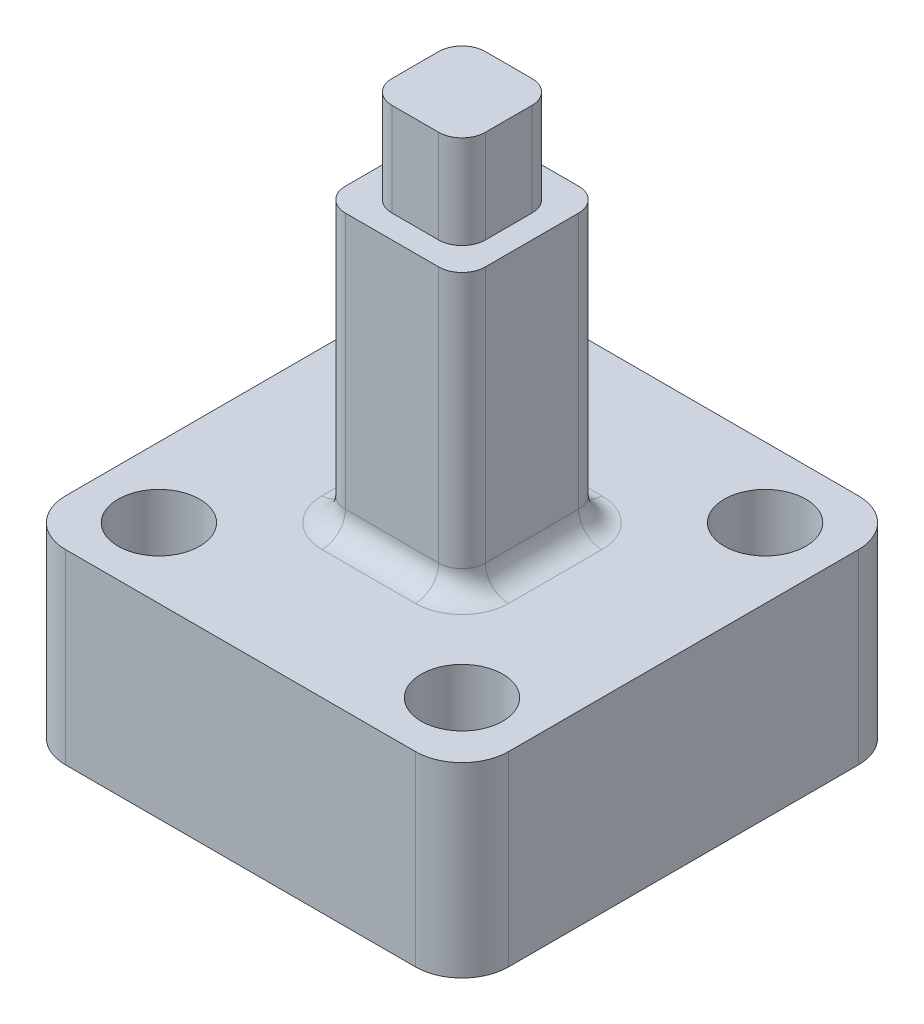
ISO-10303-21;
HEADER;
FILE_DESCRIPTION(('STEP AP214'),'2;1');
FILE_NAME('part.step','',(''),(''),'','','');
FILE_SCHEMA(('AUTOMOTIVE_DESIGN { 1 0 10303 214 1 1 1 1 }'));
ENDSEC;
DATA;
#1=APPLICATION_CONTEXT('core data for automotive mechanical design processes');
#2=APPLICATION_PROTOCOL_DEFINITION('international standard','automotive_design',2000,#1);
#3=PRODUCT_CONTEXT('',#1,'mechanical');
#4=PRODUCT('Part','Part','',(#3));
#5=PRODUCT_RELATED_PRODUCT_CATEGORY('part','',(#4));
#6=PRODUCT_DEFINITION_FORMATION('','',#4);
#7=PRODUCT_DEFINITION_CONTEXT('part definition',#1,'design');
#8=PRODUCT_DEFINITION('design','',#6,#7);
#9=PRODUCT_DEFINITION_SHAPE('','',#8);
#10=(LENGTH_UNIT() NAMED_UNIT(*) SI_UNIT(.MILLI.,.METRE.));
#11=(NAMED_UNIT(*) PLANE_ANGLE_UNIT() SI_UNIT($,.RADIAN.));
#12=(NAMED_UNIT(*) SI_UNIT($,.STERADIAN.) SOLID_ANGLE_UNIT());
#13=UNCERTAINTY_MEASURE_WITH_UNIT(LENGTH_MEASURE(1.E-05),#10,'distance_accuracy_value','');
#14=(GEOMETRIC_REPRESENTATION_CONTEXT(3) GLOBAL_UNCERTAINTY_ASSIGNED_CONTEXT((#13)) GLOBAL_UNIT_ASSIGNED_CONTEXT((#10,
#11,#12)) REPRESENTATION_CONTEXT('',''));
#15=CARTESIAN_POINT('',(0.,0.,0.));
#16=DIRECTION('',(0.,0.,1.));
#17=DIRECTION('',(1.,0.,0.));
#18=AXIS2_PLACEMENT_3D('',#15,#16,#17);
#19=CARTESIAN_POINT('',(0.,8.,0.));
#20=DIRECTION('',(0.,1.,0.));
#21=DIRECTION('',(0.,0.,1.));
#22=AXIS2_PLACEMENT_3D('',#19,#20,#21);
#23=PLANE('',#22);
#24=DIRECTION('',(1.,0.,0.));
#25=VECTOR('',#24,1.);
#26=CARTESIAN_POINT('',(9.5,8.,9.5));
#27=LINE('',#26,#25);
#28=CARTESIAN_POINT('',(-7.5,8.,9.5));
#29=VERTEX_POINT('',#28);
#30=CARTESIAN_POINT('',(7.5,8.,9.5));
#31=VERTEX_POINT('',#30);
#32=EDGE_CURVE('E560',#29,#31,#27,.T.);
#33=ORIENTED_EDGE('',*,*,#32,.T.);
#34=CARTESIAN_POINT('',(7.5,8.,7.5));
#35=DIRECTION('',(0.,1.,0.));
#36=DIRECTION('',(0.,0.,1.));
#37=AXIS2_PLACEMENT_3D('',#34,#35,#36);
#38=CIRCLE('',#37,2.);
#39=CARTESIAN_POINT('',(9.5,8.,7.5));
#40=VERTEX_POINT('',#39);
#41=EDGE_CURVE('E299',#31,#40,#38,.T.);
#42=ORIENTED_EDGE('',*,*,#41,.T.);
#43=DIRECTION('',(0.,0.,-1.));
#44=VECTOR('',#43,1.);
#45=CARTESIAN_POINT('',(9.5,8.,9.5));
#46=LINE('',#45,#44);
#47=CARTESIAN_POINT('',(9.5,8.,-7.5));
#48=VERTEX_POINT('',#47);
#49=EDGE_CURVE('E255',#40,#48,#46,.T.);
#50=ORIENTED_EDGE('',*,*,#49,.T.);
#51=CARTESIAN_POINT('',(7.5,8.,-7.5));
#52=DIRECTION('',(0.,1.,0.));
#53=DIRECTION('',(0.,0.,1.));
#54=AXIS2_PLACEMENT_3D('',#51,#52,#53);
#55=CIRCLE('',#54,2.);
#56=CARTESIAN_POINT('',(7.5,8.,-9.5));
#57=VERTEX_POINT('',#56);
#58=EDGE_CURVE('E296',#48,#57,#55,.T.);
#59=ORIENTED_EDGE('',*,*,#58,.T.);
#60=DIRECTION('',(-1.,0.,0.));
#61=VECTOR('',#60,1.);
#62=CARTESIAN_POINT('',(9.5,8.,-9.5));
#63=LINE('',#62,#61);
#64=CARTESIAN_POINT('',(-7.5,8.,-9.5));
#65=VERTEX_POINT('',#64);
#66=EDGE_CURVE('E276',#57,#65,#63,.T.);
#67=ORIENTED_EDGE('',*,*,#66,.T.);
#68=CARTESIAN_POINT('',(-7.5,8.,-7.5));
#69=DIRECTION('',(0.,1.,0.));
#70=DIRECTION('',(0.,0.,1.));
#71=AXIS2_PLACEMENT_3D('',#68,#69,#70);
#72=CIRCLE('',#71,2.);
#73=CARTESIAN_POINT('',(-9.5,8.,-7.5));
#74=VERTEX_POINT('',#73);
#75=EDGE_CURVE('E290',#65,#74,#72,.T.);
#76=ORIENTED_EDGE('',*,*,#75,.T.);
#77=DIRECTION('',(0.,0.,1.));
#78=VECTOR('',#77,1.);
#79=CARTESIAN_POINT('',(-9.5,8.,9.5));
#80=LINE('',#79,#78);
#81=CARTESIAN_POINT('',(-9.5,8.,7.5));
#82=VERTEX_POINT('',#81);
#83=EDGE_CURVE('E269',#74,#82,#80,.T.);
#84=ORIENTED_EDGE('',*,*,#83,.T.);
#85=CARTESIAN_POINT('',(-7.5,8.,7.5));
#86=DIRECTION('',(0.,1.,0.));
#87=DIRECTION('',(0.,0.,1.));
#88=AXIS2_PLACEMENT_3D('',#85,#86,#87);
#89=CIRCLE('',#88,2.);
#90=EDGE_CURVE('E293',#82,#29,#89,.T.);
#91=ORIENTED_EDGE('',*,*,#90,.T.);
#92=EDGE_LOOP('',(#33,#42,#50,#59,#67,#76,#84,#91));
#93=FACE_BOUND('',#92,.T.);
#94=CARTESIAN_POINT('',(-6.5,8.,-6.5));
#95=DIRECTION('',(0.,1.,0.));
#96=DIRECTION('',(0.,0.,1.));
#97=AXIS2_PLACEMENT_3D('',#94,#95,#96);
#98=CIRCLE('',#97,1.75);
#99=CARTESIAN_POINT('',(-6.5,8.,-4.75));
#100=VERTEX_POINT('',#99);
#101=EDGE_CURVE('E538',#100,#100,#98,.T.);
#102=ORIENTED_EDGE('',*,*,#101,.F.);
#103=EDGE_LOOP('',(#102));
#104=FACE_BOUND('',#103,.T.);
#105=CARTESIAN_POINT('',(6.5,8.,6.5));
#106=DIRECTION('',(0.,1.,0.));
#107=DIRECTION('',(0.,0.,1.));
#108=AXIS2_PLACEMENT_3D('',#105,#106,#107);
#109=CIRCLE('',#108,1.75);
#110=CARTESIAN_POINT('',(6.5,8.,8.25));
#111=VERTEX_POINT('',#110);
#112=EDGE_CURVE('E526',#111,#111,#109,.T.);
#113=ORIENTED_EDGE('',*,*,#112,.F.);
#114=EDGE_LOOP('',(#113));
#115=FACE_BOUND('',#114,.T.);
#116=CARTESIAN_POINT('',(-6.5,8.,6.5));
#117=DIRECTION('',(0.,1.,0.));
#118=DIRECTION('',(0.,0.,1.));
#119=AXIS2_PLACEMENT_3D('',#116,#117,#118);
#120=CIRCLE('',#119,1.75);
#121=CARTESIAN_POINT('',(-6.5,8.,8.25));
#122=VERTEX_POINT('',#121);
#123=EDGE_CURVE('E543',#122,#122,#120,.T.);
#124=ORIENTED_EDGE('',*,*,#123,.F.);
#125=EDGE_LOOP('',(#124));
#126=FACE_BOUND('',#125,.T.);
#127=CARTESIAN_POINT('',(6.5,8.,-6.5));
#128=DIRECTION('',(0.,1.,0.));
#129=DIRECTION('',(0.,0.,1.));
#130=AXIS2_PLACEMENT_3D('',#127,#128,#129);
#131=CIRCLE('',#130,1.75);
#132=CARTESIAN_POINT('',(6.5,8.,-4.75));
#133=VERTEX_POINT('',#132);
#134=EDGE_CURVE('E534',#133,#133,#131,.T.);
#135=ORIENTED_EDGE('',*,*,#134,.F.);
#136=EDGE_LOOP('',(#135));
#137=FACE_BOUND('',#136,.T.);
#138=CARTESIAN_POINT('',(-2.,8.,-2.));
#139=DIRECTION('',(0.,1.,0.));
#140=DIRECTION('',(0.,0.,1.));
#141=AXIS2_PLACEMENT_3D('',#138,#139,#140);
#142=CIRCLE('',#141,2.);
#143=CARTESIAN_POINT('',(-2.,8.,-4.));
#144=VERTEX_POINT('',#143);
#145=CARTESIAN_POINT('',(-4.,8.,-2.));
#146=VERTEX_POINT('',#145);
#147=EDGE_CURVE('E351',#144,#146,#142,.T.);
#148=ORIENTED_EDGE('',*,*,#147,.F.);
#149=DIRECTION('',(-1.,0.,0.));
#150=VECTOR('',#149,1.);
#151=CARTESIAN_POINT('',(0.,8.,-4.));
#152=LINE('',#151,#150);
#153=CARTESIAN_POINT('',(2.,8.,-4.));
#154=VERTEX_POINT('',#153);
#155=EDGE_CURVE('E347',#144,#154,#152,.F.);
#156=ORIENTED_EDGE('',*,*,#155,.T.);
#157=CARTESIAN_POINT('',(2.,8.,-2.));
#158=DIRECTION('',(0.,1.,0.));
#159=DIRECTION('',(0.,0.,1.));
#160=AXIS2_PLACEMENT_3D('',#157,#158,#159);
#161=CIRCLE('',#160,2.);
#162=CARTESIAN_POINT('',(4.,8.,-2.));
#163=VERTEX_POINT('',#162);
#164=EDGE_CURVE('E343',#163,#154,#161,.T.);
#165=ORIENTED_EDGE('',*,*,#164,.F.);
#166=DIRECTION('',(0.,0.,-1.));
#167=VECTOR('',#166,1.);
#168=CARTESIAN_POINT('',(4.,8.,0.));
#169=LINE('',#168,#167);
#170=CARTESIAN_POINT('',(4.,8.,2.));
#171=VERTEX_POINT('',#170);
#172=EDGE_CURVE('E337',#163,#171,#169,.F.);
#173=ORIENTED_EDGE('',*,*,#172,.T.);
#174=CARTESIAN_POINT('',(2.,8.,2.));
#175=DIRECTION('',(0.,1.,0.));
#176=DIRECTION('',(0.,0.,1.));
#177=AXIS2_PLACEMENT_3D('',#174,#175,#176);
#178=CIRCLE('',#177,2.);
#179=CARTESIAN_POINT('',(2.,8.,4.));
#180=VERTEX_POINT('',#179);
#181=EDGE_CURVE('E333',#180,#171,#178,.T.);
#182=ORIENTED_EDGE('',*,*,#181,.F.);
#183=DIRECTION('',(1.,0.,0.));
#184=VECTOR('',#183,1.);
#185=CARTESIAN_POINT('',(0.,8.,4.));
#186=LINE('',#185,#184);
#187=CARTESIAN_POINT('',(-2.,8.,4.));
#188=VERTEX_POINT('',#187);
#189=EDGE_CURVE('E330',#180,#188,#186,.F.);
#190=ORIENTED_EDGE('',*,*,#189,.T.);
#191=CARTESIAN_POINT('',(-2.,8.,2.));
#192=DIRECTION('',(0.,1.,0.));
#193=DIRECTION('',(0.,0.,1.));
#194=AXIS2_PLACEMENT_3D('',#191,#192,#193);
#195=CIRCLE('',#194,2.);
#196=CARTESIAN_POINT('',(-4.,8.,2.));
#197=VERTEX_POINT('',#196);
#198=EDGE_CURVE('E326',#197,#188,#195,.T.);
#199=ORIENTED_EDGE('',*,*,#198,.F.);
#200=DIRECTION('',(0.,0.,1.));
#201=VECTOR('',#200,1.);
#202=CARTESIAN_POINT('',(-4.,8.,0.));
#203=LINE('',#202,#201);
#204=EDGE_CURVE('E340',#197,#146,#203,.F.);
#205=ORIENTED_EDGE('',*,*,#204,.T.);
#206=EDGE_LOOP('',(#148,#156,#165,#173,#182,#190,#199,#205));
#207=FACE_BOUND('',#206,.T.);
#208=ADVANCED_FACE('F47',(#93,#104,#115,#126,#137,#207),#23,.T.);
#209=CARTESIAN_POINT('',(-9.5,8.,9.5));
#210=DIRECTION('',(1.,0.,0.));
#211=DIRECTION('',(0.,0.,-1.));
#212=AXIS2_PLACEMENT_3D('',#209,#210,#211);
#213=PLANE('',#212);
#214=DIRECTION('',(0.,0.,1.));
#215=VECTOR('',#214,1.);
#216=CARTESIAN_POINT('',(-9.5,0.,9.5));
#217=LINE('',#216,#215);
#218=CARTESIAN_POINT('',(-9.5,0.,-7.5));
#219=VERTEX_POINT('',#218);
#220=CARTESIAN_POINT('',(-9.5,0.,7.5));
#221=VERTEX_POINT('',#220);
#222=EDGE_CURVE('E271',#219,#221,#217,.T.);
#223=ORIENTED_EDGE('',*,*,#222,.T.);
#224=DIRECTION('',(0.,-1.,0.));
#225=VECTOR('',#224,1.);
#226=CARTESIAN_POINT('',(-9.5,8.,7.5));
#227=LINE('',#226,#225);
#228=EDGE_CURVE('E313',#221,#82,#227,.F.);
#229=ORIENTED_EDGE('',*,*,#228,.T.);
#230=ORIENTED_EDGE('',*,*,#83,.F.);
#231=DIRECTION('',(0.,-1.,0.));
#232=VECTOR('',#231,1.);
#233=CARTESIAN_POINT('',(-9.5,8.,-7.5));
#234=LINE('',#233,#232);
#235=EDGE_CURVE('E309',#74,#219,#234,.T.);
#236=ORIENTED_EDGE('',*,*,#235,.T.);
#237=EDGE_LOOP('',(#223,#229,#230,#236));
#238=FACE_BOUND('',#237,.T.);
#239=ADVANCED_FACE('F573',(#238),#213,.F.);
#240=CARTESIAN_POINT('',(9.5,8.,9.5));
#241=DIRECTION('',(0.,0.,-1.));
#242=DIRECTION('',(-1.,0.,0.));
#243=AXIS2_PLACEMENT_3D('',#240,#241,#242);
#244=PLANE('',#243);
#245=DIRECTION('',(1.,0.,0.));
#246=VECTOR('',#245,1.);
#247=CARTESIAN_POINT('',(9.5,0.,9.5));
#248=LINE('',#247,#246);
#249=CARTESIAN_POINT('',(-7.5,0.,9.5));
#250=VERTEX_POINT('',#249);
#251=CARTESIAN_POINT('',(7.5,0.,9.5));
#252=VERTEX_POINT('',#251);
#253=EDGE_CURVE('E264',#250,#252,#248,.T.);
#254=ORIENTED_EDGE('',*,*,#253,.T.);
#255=DIRECTION('',(0.,-1.,0.));
#256=VECTOR('',#255,1.);
#257=CARTESIAN_POINT('',(7.5,8.,9.5));
#258=LINE('',#257,#256);
#259=EDGE_CURVE('E239',#252,#31,#258,.F.);
#260=ORIENTED_EDGE('',*,*,#259,.T.);
#261=ORIENTED_EDGE('',*,*,#32,.F.);
#262=DIRECTION('',(0.,-1.,0.));
#263=VECTOR('',#262,1.);
#264=CARTESIAN_POINT('',(-7.5,8.,9.5));
#265=LINE('',#264,#263);
#266=EDGE_CURVE('E245',#29,#250,#265,.T.);
#267=ORIENTED_EDGE('',*,*,#266,.T.);
#268=EDGE_LOOP('',(#254,#260,#261,#267));
#269=FACE_BOUND('',#268,.T.);
#270=ADVANCED_FACE('F584',(#269),#244,.F.);
#271=CARTESIAN_POINT('',(9.5,8.,9.5));
#272=DIRECTION('',(-1.,0.,0.));
#273=DIRECTION('',(0.,0.,1.));
#274=AXIS2_PLACEMENT_3D('',#271,#272,#273);
#275=PLANE('',#274);
#276=ORIENTED_EDGE('',*,*,#49,.F.);
#277=DIRECTION('',(0.,-1.,0.));
#278=VECTOR('',#277,1.);
#279=CARTESIAN_POINT('',(9.5,8.,7.5));
#280=LINE('',#279,#278);
#281=CARTESIAN_POINT('',(9.5,0.,7.5));
#282=VERTEX_POINT('',#281);
#283=EDGE_CURVE('E238',#40,#282,#280,.T.);
#284=ORIENTED_EDGE('',*,*,#283,.T.);
#285=DIRECTION('',(0.,0.,-1.));
#286=VECTOR('',#285,1.);
#287=CARTESIAN_POINT('',(9.5,0.,9.5));
#288=LINE('',#287,#286);
#289=CARTESIAN_POINT('',(9.5,0.,-7.5));
#290=VERTEX_POINT('',#289);
#291=EDGE_CURVE('E252',#282,#290,#288,.T.);
#292=ORIENTED_EDGE('',*,*,#291,.T.);
#293=DIRECTION('',(0.,-1.,0.));
#294=VECTOR('',#293,1.);
#295=CARTESIAN_POINT('',(9.5,8.,-7.5));
#296=LINE('',#295,#294);
#297=EDGE_CURVE('E258',#290,#48,#296,.F.);
#298=ORIENTED_EDGE('',*,*,#297,.T.);
#299=EDGE_LOOP('',(#276,#284,#292,#298));
#300=FACE_BOUND('',#299,.T.);
#301=ADVANCED_FACE('F251',(#300),#275,.F.);
#302=CARTESIAN_POINT('',(9.5,8.,-9.5));
#303=DIRECTION('',(0.,0.,1.));
#304=DIRECTION('',(1.,0.,0.));
#305=AXIS2_PLACEMENT_3D('',#302,#303,#304);
#306=PLANE('',#305);
#307=ORIENTED_EDGE('',*,*,#66,.F.);
#308=DIRECTION('',(0.,-1.,0.));
#309=VECTOR('',#308,1.);
#310=CARTESIAN_POINT('',(7.5,8.,-9.5));
#311=LINE('',#310,#309);
#312=CARTESIAN_POINT('',(7.5,0.,-9.5));
#313=VERTEX_POINT('',#312);
#314=EDGE_CURVE('E305',#57,#313,#311,.T.);
#315=ORIENTED_EDGE('',*,*,#314,.T.);
#316=DIRECTION('',(-1.,0.,0.));
#317=VECTOR('',#316,1.);
#318=CARTESIAN_POINT('',(9.5,0.,-9.5));
#319=LINE('',#318,#317);
#320=CARTESIAN_POINT('',(-7.5,0.,-9.5));
#321=VERTEX_POINT('',#320);
#322=EDGE_CURVE('E263',#313,#321,#319,.T.);
#323=ORIENTED_EDGE('',*,*,#322,.T.);
#324=DIRECTION('',(0.,-1.,0.));
#325=VECTOR('',#324,1.);
#326=CARTESIAN_POINT('',(-7.5,8.,-9.5));
#327=LINE('',#326,#325);
#328=EDGE_CURVE('E302',#321,#65,#327,.F.);
#329=ORIENTED_EDGE('',*,*,#328,.T.);
#330=EDGE_LOOP('',(#307,#315,#323,#329));
#331=FACE_BOUND('',#330,.T.);
#332=ADVANCED_FACE('F591',(#331),#306,.F.);
#333=CARTESIAN_POINT('',(0.,0.,0.));
#334=DIRECTION('',(0.,1.,0.));
#335=DIRECTION('',(0.,0.,1.));
#336=AXIS2_PLACEMENT_3D('',#333,#334,#335);
#337=PLANE('',#336);
#338=CARTESIAN_POINT('',(6.5,0.,-6.5));
#339=DIRECTION('',(0.,1.,0.));
#340=DIRECTION('',(0.,0.,1.));
#341=AXIS2_PLACEMENT_3D('',#338,#339,#340);
#342=CIRCLE('',#341,1.75);
#343=CARTESIAN_POINT('',(6.5,0.,-4.75));
#344=VERTEX_POINT('',#343);
#345=EDGE_CURVE('E539',#344,#344,#342,.T.);
#346=ORIENTED_EDGE('',*,*,#345,.T.);
#347=EDGE_LOOP('',(#346));
#348=FACE_BOUND('',#347,.T.);
#349=CARTESIAN_POINT('',(-6.5,0.,6.5));
#350=DIRECTION('',(0.,1.,0.));
#351=DIRECTION('',(0.,0.,1.));
#352=AXIS2_PLACEMENT_3D('',#349,#350,#351);
#353=CIRCLE('',#352,1.75);
#354=CARTESIAN_POINT('',(-6.5,0.,8.25));
#355=VERTEX_POINT('',#354);
#356=EDGE_CURVE('E530',#355,#355,#353,.T.);
#357=ORIENTED_EDGE('',*,*,#356,.T.);
#358=EDGE_LOOP('',(#357));
#359=FACE_BOUND('',#358,.T.);
#360=CARTESIAN_POINT('',(6.5,0.,6.5));
#361=DIRECTION('',(0.,1.,0.));
#362=DIRECTION('',(0.,0.,1.));
#363=AXIS2_PLACEMENT_3D('',#360,#361,#362);
#364=CIRCLE('',#363,1.75);
#365=CARTESIAN_POINT('',(6.5,0.,8.25));
#366=VERTEX_POINT('',#365);
#367=EDGE_CURVE('E525',#366,#366,#364,.T.);
#368=ORIENTED_EDGE('',*,*,#367,.T.);
#369=EDGE_LOOP('',(#368));
#370=FACE_BOUND('',#369,.T.);
#371=CARTESIAN_POINT('',(-6.5,0.,-6.5));
#372=DIRECTION('',(0.,1.,0.));
#373=DIRECTION('',(0.,0.,1.));
#374=AXIS2_PLACEMENT_3D('',#371,#372,#373);
#375=CIRCLE('',#374,1.75);
#376=CARTESIAN_POINT('',(-6.5,0.,-4.75));
#377=VERTEX_POINT('',#376);
#378=EDGE_CURVE('E550',#377,#377,#375,.T.);
#379=ORIENTED_EDGE('',*,*,#378,.T.);
#380=EDGE_LOOP('',(#379));
#381=FACE_BOUND('',#380,.T.);
#382=ORIENTED_EDGE('',*,*,#291,.F.);
#383=CARTESIAN_POINT('',(7.5,0.,7.5));
#384=DIRECTION('',(0.,1.,0.));
#385=DIRECTION('',(0.,0.,1.));
#386=AXIS2_PLACEMENT_3D('',#383,#384,#385);
#387=CIRCLE('',#386,2.);
#388=EDGE_CURVE('E234',#282,#252,#387,.F.);
#389=ORIENTED_EDGE('',*,*,#388,.T.);
#390=ORIENTED_EDGE('',*,*,#253,.F.);
#391=CARTESIAN_POINT('',(-7.5,0.,7.5));
#392=DIRECTION('',(0.,1.,0.));
#393=DIRECTION('',(0.,0.,1.));
#394=AXIS2_PLACEMENT_3D('',#391,#392,#393);
#395=CIRCLE('',#394,2.);
#396=EDGE_CURVE('E280',#250,#221,#395,.F.);
#397=ORIENTED_EDGE('',*,*,#396,.T.);
#398=ORIENTED_EDGE('',*,*,#222,.F.);
#399=CARTESIAN_POINT('',(-7.5,0.,-7.5));
#400=DIRECTION('',(0.,1.,0.));
#401=DIRECTION('',(0.,0.,1.));
#402=AXIS2_PLACEMENT_3D('',#399,#400,#401);
#403=CIRCLE('',#402,2.);
#404=EDGE_CURVE('E257',#219,#321,#403,.F.);
#405=ORIENTED_EDGE('',*,*,#404,.T.);
#406=ORIENTED_EDGE('',*,*,#322,.F.);
#407=CARTESIAN_POINT('',(7.5,0.,-7.5));
#408=DIRECTION('',(0.,1.,0.));
#409=DIRECTION('',(0.,0.,1.));
#410=AXIS2_PLACEMENT_3D('',#407,#408,#409);
#411=CIRCLE('',#410,2.);
#412=EDGE_CURVE('E246',#313,#290,#411,.F.);
#413=ORIENTED_EDGE('',*,*,#412,.T.);
#414=EDGE_LOOP('',(#382,#389,#390,#397,#398,#405,#406,#413));
#415=FACE_BOUND('',#414,.T.);
#416=ADVANCED_FACE('F260',(#348,#359,#370,#381,#415),#337,.F.);
#417=CARTESIAN_POINT('',(-6.5,0.,-6.5));
#418=DIRECTION('',(0.,1.,0.));
#419=DIRECTION('',(0.,0.,1.));
#420=AXIS2_PLACEMENT_3D('',#417,#418,#419);
#421=CYLINDRICAL_SURFACE('',#420,1.75);
#422=ORIENTED_EDGE('',*,*,#378,.F.);
#423=EDGE_LOOP('',(#422));
#424=FACE_BOUND('',#423,.T.);
#425=ORIENTED_EDGE('',*,*,#101,.T.);
#426=EDGE_LOOP('',(#425));
#427=FACE_BOUND('',#426,.T.);
#428=ADVANCED_FACE('F602',(#424,#427),#421,.F.);
#429=CARTESIAN_POINT('',(6.5,0.,6.5));
#430=DIRECTION('',(0.,1.,0.));
#431=DIRECTION('',(0.,0.,1.));
#432=AXIS2_PLACEMENT_3D('',#429,#430,#431);
#433=CYLINDRICAL_SURFACE('',#432,1.75);
#434=ORIENTED_EDGE('',*,*,#367,.F.);
#435=EDGE_LOOP('',(#434));
#436=FACE_BOUND('',#435,.T.);
#437=ORIENTED_EDGE('',*,*,#112,.T.);
#438=EDGE_LOOP('',(#437));
#439=FACE_BOUND('',#438,.T.);
#440=ADVANCED_FACE('F759',(#436,#439),#433,.F.);
#441=CARTESIAN_POINT('',(-6.5,0.,6.5));
#442=DIRECTION('',(0.,1.,0.));
#443=DIRECTION('',(0.,0.,1.));
#444=AXIS2_PLACEMENT_3D('',#441,#442,#443);
#445=CYLINDRICAL_SURFACE('',#444,1.75);
#446=ORIENTED_EDGE('',*,*,#356,.F.);
#447=EDGE_LOOP('',(#446));
#448=FACE_BOUND('',#447,.T.);
#449=ORIENTED_EDGE('',*,*,#123,.T.);
#450=EDGE_LOOP('',(#449));
#451=FACE_BOUND('',#450,.T.);
#452=ADVANCED_FACE('F762',(#448,#451),#445,.F.);
#453=CARTESIAN_POINT('',(6.5,0.,-6.5));
#454=DIRECTION('',(0.,1.,0.));
#455=DIRECTION('',(0.,0.,1.));
#456=AXIS2_PLACEMENT_3D('',#453,#454,#455);
#457=CYLINDRICAL_SURFACE('',#456,1.75);
#458=ORIENTED_EDGE('',*,*,#345,.F.);
#459=EDGE_LOOP('',(#458));
#460=FACE_BOUND('',#459,.T.);
#461=ORIENTED_EDGE('',*,*,#134,.T.);
#462=EDGE_LOOP('',(#461));
#463=FACE_BOUND('',#462,.T.);
#464=ADVANCED_FACE('F757',(#460,#463),#457,.F.);
#465=CARTESIAN_POINT('',(-3.,20.,3.));
#466=DIRECTION('',(1.,0.,0.));
#467=DIRECTION('',(0.,0.,-1.));
#468=AXIS2_PLACEMENT_3D('',#465,#466,#467);
#469=PLANE('',#468);
#470=DIRECTION('',(0.,0.,1.));
#471=VECTOR('',#470,1.);
#472=CARTESIAN_POINT('',(-3.,9.,3.));
#473=LINE('',#472,#471);
#474=CARTESIAN_POINT('',(-3.,9.,-2.));
#475=VERTEX_POINT('',#474);
#476=CARTESIAN_POINT('',(-3.,9.,2.));
#477=VERTEX_POINT('',#476);
#478=EDGE_CURVE('E358',#475,#477,#473,.T.);
#479=ORIENTED_EDGE('',*,*,#478,.T.);
#480=DIRECTION('',(0.,-1.,0.));
#481=VECTOR('',#480,1.);
#482=CARTESIAN_POINT('',(-3.,20.,2.));
#483=LINE('',#482,#481);
#484=CARTESIAN_POINT('',(-3.,20.,2.));
#485=VERTEX_POINT('',#484);
#486=EDGE_CURVE('E361',#477,#485,#483,.F.);
#487=ORIENTED_EDGE('',*,*,#486,.T.);
#488=DIRECTION('',(0.,0.,1.));
#489=VECTOR('',#488,1.);
#490=CARTESIAN_POINT('',(-3.,20.,3.));
#491=LINE('',#490,#489);
#492=CARTESIAN_POINT('',(-3.,20.,-2.));
#493=VERTEX_POINT('',#492);
#494=EDGE_CURVE('E509',#493,#485,#491,.T.);
#495=ORIENTED_EDGE('',*,*,#494,.F.);
#496=DIRECTION('',(0.,-1.,0.));
#497=VECTOR('',#496,1.);
#498=CARTESIAN_POINT('',(-3.,20.,-2.));
#499=LINE('',#498,#497);
#500=EDGE_CURVE('E355',#493,#475,#499,.T.);
#501=ORIENTED_EDGE('',*,*,#500,.T.);
#502=EDGE_LOOP('',(#479,#487,#495,#501));
#503=FACE_BOUND('',#502,.T.);
#504=ADVANCED_FACE('F754',(#503),#469,.F.);
#505=CARTESIAN_POINT('',(3.,20.,3.));
#506=DIRECTION('',(0.,0.,-1.));
#507=DIRECTION('',(-1.,0.,0.));
#508=AXIS2_PLACEMENT_3D('',#505,#506,#507);
#509=PLANE('',#508);
#510=DIRECTION('',(1.,0.,0.));
#511=VECTOR('',#510,1.);
#512=CARTESIAN_POINT('',(3.,9.,3.));
#513=LINE('',#512,#511);
#514=CARTESIAN_POINT('',(-2.,9.,3.));
#515=VERTEX_POINT('',#514);
#516=CARTESIAN_POINT('',(2.,9.,3.));
#517=VERTEX_POINT('',#516);
#518=EDGE_CURVE('E376',#515,#517,#513,.T.);
#519=ORIENTED_EDGE('',*,*,#518,.T.);
#520=DIRECTION('',(0.,-1.,0.));
#521=VECTOR('',#520,1.);
#522=CARTESIAN_POINT('',(2.,20.,3.));
#523=LINE('',#522,#521);
#524=CARTESIAN_POINT('',(2.,20.,3.));
#525=VERTEX_POINT('',#524);
#526=EDGE_CURVE('E379',#517,#525,#523,.F.);
#527=ORIENTED_EDGE('',*,*,#526,.T.);
#528=DIRECTION('',(1.,0.,0.));
#529=VECTOR('',#528,1.);
#530=CARTESIAN_POINT('',(3.,20.,3.));
#531=LINE('',#530,#529);
#532=CARTESIAN_POINT('',(-2.,20.,3.));
#533=VERTEX_POINT('',#532);
#534=EDGE_CURVE('E513',#533,#525,#531,.T.);
#535=ORIENTED_EDGE('',*,*,#534,.F.);
#536=DIRECTION('',(0.,-1.,0.));
#537=VECTOR('',#536,1.);
#538=CARTESIAN_POINT('',(-2.,20.,3.));
#539=LINE('',#538,#537);
#540=EDGE_CURVE('E373',#533,#515,#539,.T.);
#541=ORIENTED_EDGE('',*,*,#540,.T.);
#542=EDGE_LOOP('',(#519,#527,#535,#541));
#543=FACE_BOUND('',#542,.T.);
#544=ADVANCED_FACE('F750',(#543),#509,.F.);
#545=CARTESIAN_POINT('',(3.,20.,3.));
#546=DIRECTION('',(-1.,0.,0.));
#547=DIRECTION('',(0.,0.,1.));
#548=AXIS2_PLACEMENT_3D('',#545,#546,#547);
#549=PLANE('',#548);
#550=DIRECTION('',(0.,0.,-1.));
#551=VECTOR('',#550,1.);
#552=CARTESIAN_POINT('',(3.,20.,3.));
#553=LINE('',#552,#551);
#554=CARTESIAN_POINT('',(3.,20.,2.));
#555=VERTEX_POINT('',#554);
#556=CARTESIAN_POINT('',(3.,20.,-2.));
#557=VERTEX_POINT('',#556);
#558=EDGE_CURVE('E517',#555,#557,#553,.T.);
#559=ORIENTED_EDGE('',*,*,#558,.F.);
#560=DIRECTION('',(0.,-1.,0.));
#561=VECTOR('',#560,1.);
#562=CARTESIAN_POINT('',(3.,20.,2.));
#563=LINE('',#562,#561);
#564=CARTESIAN_POINT('',(3.,9.,2.));
#565=VERTEX_POINT('',#564);
#566=EDGE_CURVE('E370',#555,#565,#563,.T.);
#567=ORIENTED_EDGE('',*,*,#566,.T.);
#568=DIRECTION('',(0.,0.,-1.));
#569=VECTOR('',#568,1.);
#570=CARTESIAN_POINT('',(3.,9.,3.));
#571=LINE('',#570,#569);
#572=CARTESIAN_POINT('',(3.,9.,-2.));
#573=VERTEX_POINT('',#572);
#574=EDGE_CURVE('E367',#565,#573,#571,.T.);
#575=ORIENTED_EDGE('',*,*,#574,.T.);
#576=DIRECTION('',(0.,-1.,0.));
#577=VECTOR('',#576,1.);
#578=CARTESIAN_POINT('',(3.,20.,-2.));
#579=LINE('',#578,#577);
#580=EDGE_CURVE('E364',#573,#557,#579,.F.);
#581=ORIENTED_EDGE('',*,*,#580,.T.);
#582=EDGE_LOOP('',(#559,#567,#575,#581));
#583=FACE_BOUND('',#582,.T.);
#584=ADVANCED_FACE('F746',(#583),#549,.F.);
#585=CARTESIAN_POINT('',(3.,20.,-3.));
#586=DIRECTION('',(0.,0.,1.));
#587=DIRECTION('',(1.,0.,0.));
#588=AXIS2_PLACEMENT_3D('',#585,#586,#587);
#589=PLANE('',#588);
#590=DIRECTION('',(-1.,0.,0.));
#591=VECTOR('',#590,1.);
#592=CARTESIAN_POINT('',(3.,9.,-3.));
#593=LINE('',#592,#591);
#594=CARTESIAN_POINT('',(2.,9.,-3.));
#595=VERTEX_POINT('',#594);
#596=CARTESIAN_POINT('',(-2.,9.,-3.));
#597=VERTEX_POINT('',#596);
#598=EDGE_CURVE('E319',#595,#597,#593,.T.);
#599=ORIENTED_EDGE('',*,*,#598,.T.);
#600=DIRECTION('',(0.,-1.,0.));
#601=VECTOR('',#600,1.);
#602=CARTESIAN_POINT('',(-2.,20.,-3.));
#603=LINE('',#602,#601);
#604=CARTESIAN_POINT('',(-2.,20.,-3.));
#605=VERTEX_POINT('',#604);
#606=EDGE_CURVE('E323',#597,#605,#603,.F.);
#607=ORIENTED_EDGE('',*,*,#606,.T.);
#608=DIRECTION('',(-1.,0.,0.));
#609=VECTOR('',#608,1.);
#610=CARTESIAN_POINT('',(3.,20.,-3.));
#611=LINE('',#610,#609);
#612=CARTESIAN_POINT('',(2.,20.,-3.));
#613=VERTEX_POINT('',#612);
#614=EDGE_CURVE('E521',#613,#605,#611,.T.);
#615=ORIENTED_EDGE('',*,*,#614,.F.);
#616=DIRECTION('',(0.,-1.,0.));
#617=VECTOR('',#616,1.);
#618=CARTESIAN_POINT('',(2.,20.,-3.));
#619=LINE('',#618,#617);
#620=EDGE_CURVE('E316',#613,#595,#619,.T.);
#621=ORIENTED_EDGE('',*,*,#620,.T.);
#622=EDGE_LOOP('',(#599,#607,#615,#621));
#623=FACE_BOUND('',#622,.T.);
#624=ADVANCED_FACE('F743',(#623),#589,.F.);
#625=CARTESIAN_POINT('',(0.,20.,0.));
#626=DIRECTION('',(0.,1.,0.));
#627=DIRECTION('',(0.,0.,1.));
#628=AXIS2_PLACEMENT_3D('',#625,#626,#627);
#629=PLANE('',#628);
#630=DIRECTION('',(0.,0.,1.));
#631=VECTOR('',#630,1.);
#632=CARTESIAN_POINT('',(-2.,20.,2.));
#633=LINE('',#632,#631);
#634=CARTESIAN_POINT('',(-2.,20.,-1.));
#635=VERTEX_POINT('',#634);
#636=CARTESIAN_POINT('',(-2.,20.,1.));
#637=VERTEX_POINT('',#636);
#638=EDGE_CURVE('E486',#635,#637,#633,.T.);
#639=ORIENTED_EDGE('',*,*,#638,.F.);
#640=CARTESIAN_POINT('',(-1.,20.,-1.));
#641=DIRECTION('',(0.,1.,0.));
#642=DIRECTION('',(0.,0.,1.));
#643=AXIS2_PLACEMENT_3D('',#640,#641,#642);
#644=CIRCLE('',#643,1.);
#645=CARTESIAN_POINT('',(-1.,20.,-2.));
#646=VERTEX_POINT('',#645);
#647=EDGE_CURVE('E436',#635,#646,#644,.F.);
#648=ORIENTED_EDGE('',*,*,#647,.T.);
#649=DIRECTION('',(-1.,0.,0.));
#650=VECTOR('',#649,1.);
#651=CARTESIAN_POINT('',(2.,20.,-2.));
#652=LINE('',#651,#650);
#653=CARTESIAN_POINT('',(1.,20.,-2.));
#654=VERTEX_POINT('',#653);
#655=EDGE_CURVE('E504',#654,#646,#652,.T.);
#656=ORIENTED_EDGE('',*,*,#655,.F.);
#657=CARTESIAN_POINT('',(1.,20.,-1.));
#658=DIRECTION('',(0.,1.,0.));
#659=DIRECTION('',(0.,0.,1.));
#660=AXIS2_PLACEMENT_3D('',#657,#658,#659);
#661=CIRCLE('',#660,1.);
#662=CARTESIAN_POINT('',(2.,20.,-1.));
#663=VERTEX_POINT('',#662);
#664=EDGE_CURVE('E433',#654,#663,#661,.F.);
#665=ORIENTED_EDGE('',*,*,#664,.T.);
#666=DIRECTION('',(0.,0.,-1.));
#667=VECTOR('',#666,1.);
#668=CARTESIAN_POINT('',(2.,20.,2.));
#669=LINE('',#668,#667);
#670=CARTESIAN_POINT('',(2.,20.,1.));
#671=VERTEX_POINT('',#670);
#672=EDGE_CURVE('E495',#671,#663,#669,.T.);
#673=ORIENTED_EDGE('',*,*,#672,.F.);
#674=CARTESIAN_POINT('',(1.,20.,1.));
#675=DIRECTION('',(0.,1.,0.));
#676=DIRECTION('',(0.,0.,1.));
#677=AXIS2_PLACEMENT_3D('',#674,#675,#676);
#678=CIRCLE('',#677,1.);
#679=CARTESIAN_POINT('',(1.,20.,2.));
#680=VERTEX_POINT('',#679);
#681=EDGE_CURVE('E11',#671,#680,#678,.F.);
#682=ORIENTED_EDGE('',*,*,#681,.T.);
#683=DIRECTION('',(1.,0.,0.));
#684=VECTOR('',#683,1.);
#685=CARTESIAN_POINT('',(2.,20.,2.));
#686=LINE('',#685,#684);
#687=CARTESIAN_POINT('',(-1.,20.,2.));
#688=VERTEX_POINT('',#687);
#689=EDGE_CURVE('E490',#688,#680,#686,.T.);
#690=ORIENTED_EDGE('',*,*,#689,.F.);
#691=CARTESIAN_POINT('',(-1.,20.,1.));
#692=DIRECTION('',(0.,1.,0.));
#693=DIRECTION('',(0.,0.,1.));
#694=AXIS2_PLACEMENT_3D('',#691,#692,#693);
#695=CIRCLE('',#694,1.);
#696=EDGE_CURVE('E57',#688,#637,#695,.F.);
#697=ORIENTED_EDGE('',*,*,#696,.T.);
#698=EDGE_LOOP('',(#639,#648,#656,#665,#673,#682,#690,#697));
#699=FACE_BOUND('',#698,.T.);
#700=ORIENTED_EDGE('',*,*,#534,.T.);
#701=CARTESIAN_POINT('',(2.,20.,2.));
#702=DIRECTION('',(0.,1.,0.));
#703=DIRECTION('',(0.,0.,1.));
#704=AXIS2_PLACEMENT_3D('',#701,#702,#703);
#705=CIRCLE('',#704,1.);
#706=EDGE_CURVE('E430',#525,#555,#705,.T.);
#707=ORIENTED_EDGE('',*,*,#706,.T.);
#708=ORIENTED_EDGE('',*,*,#558,.T.);
#709=CARTESIAN_POINT('',(2.,20.,-2.));
#710=DIRECTION('',(0.,1.,0.));
#711=DIRECTION('',(0.,0.,1.));
#712=AXIS2_PLACEMENT_3D('',#709,#710,#711);
#713=CIRCLE('',#712,1.);
#714=EDGE_CURVE('E421',#557,#613,#713,.T.);
#715=ORIENTED_EDGE('',*,*,#714,.T.);
#716=ORIENTED_EDGE('',*,*,#614,.T.);
#717=CARTESIAN_POINT('',(-2.,20.,-2.));
#718=DIRECTION('',(0.,1.,0.));
#719=DIRECTION('',(0.,0.,1.));
#720=AXIS2_PLACEMENT_3D('',#717,#718,#719);
#721=CIRCLE('',#720,1.);
#722=EDGE_CURVE('E424',#605,#493,#721,.T.);
#723=ORIENTED_EDGE('',*,*,#722,.T.);
#724=ORIENTED_EDGE('',*,*,#494,.T.);
#725=CARTESIAN_POINT('',(-2.,20.,2.));
#726=DIRECTION('',(0.,1.,0.));
#727=DIRECTION('',(0.,0.,1.));
#728=AXIS2_PLACEMENT_3D('',#725,#726,#727);
#729=CIRCLE('',#728,1.);
#730=EDGE_CURVE('E427',#485,#533,#729,.T.);
#731=ORIENTED_EDGE('',*,*,#730,.T.);
#732=EDGE_LOOP('',(#700,#707,#708,#715,#716,#723,#724,#731));
#733=FACE_BOUND('',#732,.T.);
#734=ADVANCED_FACE('F626',(#699,#733),#629,.T.);
#735=CARTESIAN_POINT('',(7.5,8.,7.5));
#736=DIRECTION('',(0.,-1.,0.));
#737=DIRECTION('',(0.,0.,-1.));
#738=AXIS2_PLACEMENT_3D('',#735,#736,#737);
#739=CYLINDRICAL_SURFACE('',#738,2.);
#740=ORIENTED_EDGE('',*,*,#41,.F.);
#741=ORIENTED_EDGE('',*,*,#259,.F.);
#742=ORIENTED_EDGE('',*,*,#388,.F.);
#743=ORIENTED_EDGE('',*,*,#283,.F.);
#744=EDGE_LOOP('',(#740,#741,#742,#743));
#745=FACE_BOUND('',#744,.T.);
#746=ADVANCED_FACE('F237',(#745),#739,.T.);
#747=CARTESIAN_POINT('',(7.5,8.,-7.5));
#748=DIRECTION('',(0.,-1.,0.));
#749=DIRECTION('',(0.,0.,-1.));
#750=AXIS2_PLACEMENT_3D('',#747,#748,#749);
#751=CYLINDRICAL_SURFACE('',#750,2.);
#752=ORIENTED_EDGE('',*,*,#58,.F.);
#753=ORIENTED_EDGE('',*,*,#297,.F.);
#754=ORIENTED_EDGE('',*,*,#412,.F.);
#755=ORIENTED_EDGE('',*,*,#314,.F.);
#756=EDGE_LOOP('',(#752,#753,#754,#755));
#757=FACE_BOUND('',#756,.T.);
#758=ADVANCED_FACE('F617',(#757),#751,.T.);
#759=CARTESIAN_POINT('',(-7.5,8.,7.5));
#760=DIRECTION('',(0.,-1.,0.));
#761=DIRECTION('',(0.,0.,-1.));
#762=AXIS2_PLACEMENT_3D('',#759,#760,#761);
#763=CYLINDRICAL_SURFACE('',#762,2.);
#764=ORIENTED_EDGE('',*,*,#90,.F.);
#765=ORIENTED_EDGE('',*,*,#228,.F.);
#766=ORIENTED_EDGE('',*,*,#396,.F.);
#767=ORIENTED_EDGE('',*,*,#266,.F.);
#768=EDGE_LOOP('',(#764,#765,#766,#767));
#769=FACE_BOUND('',#768,.T.);
#770=ADVANCED_FACE('F578',(#769),#763,.T.);
#771=CARTESIAN_POINT('',(-7.5,8.,-7.5));
#772=DIRECTION('',(0.,-1.,0.));
#773=DIRECTION('',(0.,0.,-1.));
#774=AXIS2_PLACEMENT_3D('',#771,#772,#773);
#775=CYLINDRICAL_SURFACE('',#774,2.);
#776=ORIENTED_EDGE('',*,*,#75,.F.);
#777=ORIENTED_EDGE('',*,*,#328,.F.);
#778=ORIENTED_EDGE('',*,*,#404,.F.);
#779=ORIENTED_EDGE('',*,*,#235,.F.);
#780=EDGE_LOOP('',(#776,#777,#778,#779));
#781=FACE_BOUND('',#780,.T.);
#782=ADVANCED_FACE('F624',(#781),#775,.T.);
#783=CARTESIAN_POINT('',(-2.,24.,2.));
#784=DIRECTION('',(1.,0.,0.));
#785=DIRECTION('',(0.,0.,-1.));
#786=AXIS2_PLACEMENT_3D('',#783,#784,#785);
#787=PLANE('',#786);
#788=DIRECTION('',(0.,0.,1.));
#789=VECTOR('',#788,1.);
#790=CARTESIAN_POINT('',(-2.,24.,2.));
#791=LINE('',#790,#789);
#792=CARTESIAN_POINT('',(-2.,24.,-1.));
#793=VERTEX_POINT('',#792);
#794=CARTESIAN_POINT('',(-2.,24.,1.));
#795=VERTEX_POINT('',#794);
#796=EDGE_CURVE('E508',#793,#795,#791,.T.);
#797=ORIENTED_EDGE('',*,*,#796,.F.);
#798=DIRECTION('',(0.,-1.,0.));
#799=VECTOR('',#798,1.);
#800=CARTESIAN_POINT('',(-2.,24.,-1.));
#801=LINE('',#800,#799);
#802=EDGE_CURVE('E411',#793,#635,#801,.T.);
#803=ORIENTED_EDGE('',*,*,#802,.T.);
#804=ORIENTED_EDGE('',*,*,#638,.T.);
#805=DIRECTION('',(0.,-1.,0.));
#806=VECTOR('',#805,1.);
#807=CARTESIAN_POINT('',(-2.,24.,1.));
#808=LINE('',#807,#806);
#809=EDGE_CURVE('E408',#637,#795,#808,.F.);
#810=ORIENTED_EDGE('',*,*,#809,.T.);
#811=EDGE_LOOP('',(#797,#803,#804,#810));
#812=FACE_BOUND('',#811,.T.);
#813=ADVANCED_FACE('F630',(#812),#787,.F.);
#814=CARTESIAN_POINT('',(2.,24.,2.));
#815=DIRECTION('',(0.,0.,-1.));
#816=DIRECTION('',(-1.,0.,0.));
#817=AXIS2_PLACEMENT_3D('',#814,#815,#816);
#818=PLANE('',#817);
#819=DIRECTION('',(1.,0.,0.));
#820=VECTOR('',#819,1.);
#821=CARTESIAN_POINT('',(2.,24.,2.));
#822=LINE('',#821,#820);
#823=CARTESIAN_POINT('',(-1.,24.,2.));
#824=VERTEX_POINT('',#823);
#825=CARTESIAN_POINT('',(1.,24.,2.));
#826=VERTEX_POINT('',#825);
#827=EDGE_CURVE('E699',#824,#826,#822,.T.);
#828=ORIENTED_EDGE('',*,*,#827,.F.);
#829=DIRECTION('',(0.,-1.,0.));
#830=VECTOR('',#829,1.);
#831=CARTESIAN_POINT('',(-1.,24.,2.));
#832=LINE('',#831,#830);
#833=EDGE_CURVE('E418',#824,#688,#832,.T.);
#834=ORIENTED_EDGE('',*,*,#833,.T.);
#835=ORIENTED_EDGE('',*,*,#689,.T.);
#836=DIRECTION('',(0.,-1.,0.));
#837=VECTOR('',#836,1.);
#838=CARTESIAN_POINT('',(1.,24.,2.));
#839=LINE('',#838,#837);
#840=EDGE_CURVE('E415',#680,#826,#839,.F.);
#841=ORIENTED_EDGE('',*,*,#840,.T.);
#842=EDGE_LOOP('',(#828,#834,#835,#841));
#843=FACE_BOUND('',#842,.T.);
#844=ADVANCED_FACE('F703',(#843),#818,.F.);
#845=CARTESIAN_POINT('',(2.,24.,2.));
#846=DIRECTION('',(-1.,0.,0.));
#847=DIRECTION('',(0.,0.,1.));
#848=AXIS2_PLACEMENT_3D('',#845,#846,#847);
#849=PLANE('',#848);
#850=ORIENTED_EDGE('',*,*,#672,.T.);
#851=DIRECTION('',(0.,-1.,0.));
#852=VECTOR('',#851,1.);
#853=CARTESIAN_POINT('',(2.,24.,-1.));
#854=LINE('',#853,#852);
#855=CARTESIAN_POINT('',(2.,24.,-1.));
#856=VERTEX_POINT('',#855);
#857=EDGE_CURVE('E393',#663,#856,#854,.F.);
#858=ORIENTED_EDGE('',*,*,#857,.T.);
#859=DIRECTION('',(0.,0.,-1.));
#860=VECTOR('',#859,1.);
#861=CARTESIAN_POINT('',(2.,24.,2.));
#862=LINE('',#861,#860);
#863=CARTESIAN_POINT('',(2.,24.,1.));
#864=VERTEX_POINT('',#863);
#865=EDGE_CURVE('E706',#864,#856,#862,.T.);
#866=ORIENTED_EDGE('',*,*,#865,.F.);
#867=DIRECTION('',(0.,-1.,0.));
#868=VECTOR('',#867,1.);
#869=CARTESIAN_POINT('',(2.,24.,1.));
#870=LINE('',#869,#868);
#871=EDGE_CURVE('E389',#864,#671,#870,.T.);
#872=ORIENTED_EDGE('',*,*,#871,.T.);
#873=EDGE_LOOP('',(#850,#858,#866,#872));
#874=FACE_BOUND('',#873,.T.);
#875=ADVANCED_FACE('F725',(#874),#849,.F.);
#876=CARTESIAN_POINT('',(2.,24.,-2.));
#877=DIRECTION('',(0.,0.,1.));
#878=DIRECTION('',(1.,0.,0.));
#879=AXIS2_PLACEMENT_3D('',#876,#877,#878);
#880=PLANE('',#879);
#881=DIRECTION('',(-1.,0.,0.));
#882=VECTOR('',#881,1.);
#883=CARTESIAN_POINT('',(2.,24.,-2.));
#884=LINE('',#883,#882);
#885=CARTESIAN_POINT('',(1.,24.,-2.));
#886=VERTEX_POINT('',#885);
#887=CARTESIAN_POINT('',(-1.,24.,-2.));
#888=VERTEX_POINT('',#887);
#889=EDGE_CURVE('E498',#886,#888,#884,.T.);
#890=ORIENTED_EDGE('',*,*,#889,.F.);
#891=DIRECTION('',(0.,-1.,0.));
#892=VECTOR('',#891,1.);
#893=CARTESIAN_POINT('',(1.,24.,-2.));
#894=LINE('',#893,#892);
#895=EDGE_CURVE('E385',#886,#654,#894,.T.);
#896=ORIENTED_EDGE('',*,*,#895,.T.);
#897=ORIENTED_EDGE('',*,*,#655,.T.);
#898=DIRECTION('',(0.,-1.,0.));
#899=VECTOR('',#898,1.);
#900=CARTESIAN_POINT('',(-1.,24.,-2.));
#901=LINE('',#900,#899);
#902=EDGE_CURVE('E382',#646,#888,#901,.F.);
#903=ORIENTED_EDGE('',*,*,#902,.T.);
#904=EDGE_LOOP('',(#890,#896,#897,#903));
#905=FACE_BOUND('',#904,.T.);
#906=ADVANCED_FACE('F727',(#905),#880,.F.);
#907=CARTESIAN_POINT('',(0.,24.,0.));
#908=DIRECTION('',(0.,1.,0.));
#909=DIRECTION('',(0.,0.,1.));
#910=AXIS2_PLACEMENT_3D('',#907,#908,#909);
#911=PLANE('',#910);
#912=ORIENTED_EDGE('',*,*,#865,.T.);
#913=CARTESIAN_POINT('',(1.,24.,-1.));
#914=DIRECTION('',(0.,1.,0.));
#915=DIRECTION('',(0.,0.,1.));
#916=AXIS2_PLACEMENT_3D('',#913,#914,#915);
#917=CIRCLE('',#916,1.);
#918=EDGE_CURVE('E405',#856,#886,#917,.T.);
#919=ORIENTED_EDGE('',*,*,#918,.T.);
#920=ORIENTED_EDGE('',*,*,#889,.T.);
#921=CARTESIAN_POINT('',(-1.,24.,-1.));
#922=DIRECTION('',(0.,1.,0.));
#923=DIRECTION('',(0.,0.,1.));
#924=AXIS2_PLACEMENT_3D('',#921,#922,#923);
#925=CIRCLE('',#924,1.);
#926=EDGE_CURVE('E402',#888,#793,#925,.T.);
#927=ORIENTED_EDGE('',*,*,#926,.T.);
#928=ORIENTED_EDGE('',*,*,#796,.T.);
#929=CARTESIAN_POINT('',(-1.,24.,1.));
#930=DIRECTION('',(0.,1.,0.));
#931=DIRECTION('',(0.,0.,1.));
#932=AXIS2_PLACEMENT_3D('',#929,#930,#931);
#933=CIRCLE('',#932,1.);
#934=EDGE_CURVE('E399',#795,#824,#933,.T.);
#935=ORIENTED_EDGE('',*,*,#934,.T.);
#936=ORIENTED_EDGE('',*,*,#827,.T.);
#937=CARTESIAN_POINT('',(1.,24.,1.));
#938=DIRECTION('',(0.,1.,0.));
#939=DIRECTION('',(0.,0.,1.));
#940=AXIS2_PLACEMENT_3D('',#937,#938,#939);
#941=CIRCLE('',#940,1.);
#942=EDGE_CURVE('E396',#826,#864,#941,.T.);
#943=ORIENTED_EDGE('',*,*,#942,.T.);
#944=EDGE_LOOP('',(#912,#919,#920,#927,#928,#935,#936,#943));
#945=FACE_BOUND('',#944,.T.);
#946=ADVANCED_FACE('F679',(#945),#911,.T.);
#947=CARTESIAN_POINT('',(2.,20.,2.));
#948=DIRECTION('',(0.,-1.,0.));
#949=DIRECTION('',(0.,0.,-1.));
#950=AXIS2_PLACEMENT_3D('',#947,#948,#949);
#951=CYLINDRICAL_SURFACE('',#950,1.);
#952=ORIENTED_EDGE('',*,*,#706,.F.);
#953=ORIENTED_EDGE('',*,*,#526,.F.);
#954=CARTESIAN_POINT('',(2.,9.,2.));
#955=DIRECTION('',(0.,1.,0.));
#956=DIRECTION('',(0.,0.,1.));
#957=AXIS2_PLACEMENT_3D('',#954,#955,#956);
#958=CIRCLE('',#957,1.);
#959=EDGE_CURVE('E478',#565,#517,#958,.F.);
#960=ORIENTED_EDGE('',*,*,#959,.F.);
#961=ORIENTED_EDGE('',*,*,#566,.F.);
#962=EDGE_LOOP('',(#952,#953,#960,#961));
#963=FACE_BOUND('',#962,.T.);
#964=ADVANCED_FACE('F675',(#963),#951,.T.);
#965=CARTESIAN_POINT('',(-2.,20.,2.));
#966=DIRECTION('',(0.,-1.,0.));
#967=DIRECTION('',(0.,0.,-1.));
#968=AXIS2_PLACEMENT_3D('',#965,#966,#967);
#969=CYLINDRICAL_SURFACE('',#968,1.);
#970=ORIENTED_EDGE('',*,*,#730,.F.);
#971=ORIENTED_EDGE('',*,*,#486,.F.);
#972=CARTESIAN_POINT('',(-2.,9.,2.));
#973=DIRECTION('',(0.,1.,0.));
#974=DIRECTION('',(0.,0.,1.));
#975=AXIS2_PLACEMENT_3D('',#972,#973,#974);
#976=CIRCLE('',#975,1.);
#977=EDGE_CURVE('E475',#515,#477,#976,.F.);
#978=ORIENTED_EDGE('',*,*,#977,.F.);
#979=ORIENTED_EDGE('',*,*,#540,.F.);
#980=EDGE_LOOP('',(#970,#971,#978,#979));
#981=FACE_BOUND('',#980,.T.);
#982=ADVANCED_FACE('F671',(#981),#969,.T.);
#983=CARTESIAN_POINT('',(3.,9.,4.));
#984=DIRECTION('',(1.,0.,0.));
#985=DIRECTION('',(0.,0.,-1.));
#986=AXIS2_PLACEMENT_3D('',#983,#984,#985);
#987=CYLINDRICAL_SURFACE('',#986,1.);
#988=CARTESIAN_POINT('',(-2.,9.,4.));
#989=DIRECTION('',(1.,0.,0.));
#990=DIRECTION('',(0.,0.,-1.));
#991=AXIS2_PLACEMENT_3D('',#988,#989,#990);
#992=CIRCLE('',#991,1.);
#993=EDGE_CURVE('E471',#188,#515,#992,.T.);
#994=ORIENTED_EDGE('',*,*,#993,.F.);
#995=ORIENTED_EDGE('',*,*,#189,.F.);
#996=CARTESIAN_POINT('',(2.,9.,4.));
#997=DIRECTION('',(-1.,0.,0.));
#998=DIRECTION('',(0.,0.,1.));
#999=AXIS2_PLACEMENT_3D('',#996,#997,#998);
#1000=CIRCLE('',#999,1.);
#1001=EDGE_CURVE('E51',#517,#180,#1000,.T.);
#1002=ORIENTED_EDGE('',*,*,#1001,.F.);
#1003=ORIENTED_EDGE('',*,*,#518,.F.);
#1004=EDGE_LOOP('',(#994,#995,#1002,#1003));
#1005=FACE_BOUND('',#1004,.T.);
#1006=ADVANCED_FACE('F668',(#1005),#987,.F.);
#1007=CARTESIAN_POINT('',(2.,9.,2.));
#1008=DIRECTION('',(0.,1.,0.));
#1009=DIRECTION('',(0.,0.,1.));
#1010=AXIS2_PLACEMENT_3D('',#1007,#1008,#1009);
#1011=TOROIDAL_SURFACE('',#1010,2.,1.);
#1012=ORIENTED_EDGE('',*,*,#1001,.T.);
#1013=ORIENTED_EDGE('',*,*,#181,.T.);
#1014=CARTESIAN_POINT('',(4.,9.,2.));
#1015=DIRECTION('',(0.,0.,-1.));
#1016=DIRECTION('',(-1.,0.,0.));
#1017=AXIS2_PLACEMENT_3D('',#1014,#1015,#1016);
#1018=CIRCLE('',#1017,1.);
#1019=EDGE_CURVE('E467',#565,#171,#1018,.F.);
#1020=ORIENTED_EDGE('',*,*,#1019,.F.);
#1021=ORIENTED_EDGE('',*,*,#959,.T.);
#1022=EDGE_LOOP('',(#1012,#1013,#1020,#1021));
#1023=FACE_BOUND('',#1022,.T.);
#1024=ADVANCED_FACE('F664',(#1023),#1011,.F.);
#1025=CARTESIAN_POINT('',(-2.,9.,2.));
#1026=DIRECTION('',(0.,1.,0.));
#1027=DIRECTION('',(0.,0.,1.));
#1028=AXIS2_PLACEMENT_3D('',#1025,#1026,#1027);
#1029=TOROIDAL_SURFACE('',#1028,2.,1.);
#1030=ORIENTED_EDGE('',*,*,#993,.T.);
#1031=ORIENTED_EDGE('',*,*,#977,.T.);
#1032=CARTESIAN_POINT('',(-4.,9.,2.));
#1033=DIRECTION('',(0.,0.,-1.));
#1034=DIRECTION('',(-1.,0.,0.));
#1035=AXIS2_PLACEMENT_3D('',#1032,#1033,#1034);
#1036=CIRCLE('',#1035,1.);
#1037=EDGE_CURVE('E463',#197,#477,#1036,.F.);
#1038=ORIENTED_EDGE('',*,*,#1037,.F.);
#1039=ORIENTED_EDGE('',*,*,#198,.T.);
#1040=EDGE_LOOP('',(#1030,#1031,#1038,#1039));
#1041=FACE_BOUND('',#1040,.T.);
#1042=ADVANCED_FACE('F660',(#1041),#1029,.F.);
#1043=CARTESIAN_POINT('',(4.,9.,3.));
#1044=DIRECTION('',(0.,0.,-1.));
#1045=DIRECTION('',(-1.,0.,0.));
#1046=AXIS2_PLACEMENT_3D('',#1043,#1044,#1045);
#1047=CYLINDRICAL_SURFACE('',#1046,1.);
#1048=ORIENTED_EDGE('',*,*,#1019,.T.);
#1049=ORIENTED_EDGE('',*,*,#172,.F.);
#1050=CARTESIAN_POINT('',(4.,9.,-2.));
#1051=DIRECTION('',(0.,0.,1.));
#1052=DIRECTION('',(1.,0.,0.));
#1053=AXIS2_PLACEMENT_3D('',#1050,#1051,#1052);
#1054=CIRCLE('',#1053,1.);
#1055=EDGE_CURVE('E459',#573,#163,#1054,.T.);
#1056=ORIENTED_EDGE('',*,*,#1055,.F.);
#1057=ORIENTED_EDGE('',*,*,#574,.F.);
#1058=EDGE_LOOP('',(#1048,#1049,#1056,#1057));
#1059=FACE_BOUND('',#1058,.T.);
#1060=ADVANCED_FACE('F656',(#1059),#1047,.F.);
#1061=CARTESIAN_POINT('',(2.,20.,-2.));
#1062=DIRECTION('',(0.,-1.,0.));
#1063=DIRECTION('',(0.,0.,-1.));
#1064=AXIS2_PLACEMENT_3D('',#1061,#1062,#1063);
#1065=CYLINDRICAL_SURFACE('',#1064,1.);
#1066=ORIENTED_EDGE('',*,*,#714,.F.);
#1067=ORIENTED_EDGE('',*,*,#580,.F.);
#1068=CARTESIAN_POINT('',(2.,9.,-2.));
#1069=DIRECTION('',(0.,1.,0.));
#1070=DIRECTION('',(0.,0.,1.));
#1071=AXIS2_PLACEMENT_3D('',#1068,#1069,#1070);
#1072=CIRCLE('',#1071,1.);
#1073=EDGE_CURVE('E455',#595,#573,#1072,.F.);
#1074=ORIENTED_EDGE('',*,*,#1073,.F.);
#1075=ORIENTED_EDGE('',*,*,#620,.F.);
#1076=EDGE_LOOP('',(#1066,#1067,#1074,#1075));
#1077=FACE_BOUND('',#1076,.T.);
#1078=ADVANCED_FACE('F652',(#1077),#1065,.T.);
#1079=CARTESIAN_POINT('',(-2.,20.,-2.));
#1080=DIRECTION('',(0.,-1.,0.));
#1081=DIRECTION('',(0.,0.,-1.));
#1082=AXIS2_PLACEMENT_3D('',#1079,#1080,#1081);
#1083=CYLINDRICAL_SURFACE('',#1082,1.);
#1084=ORIENTED_EDGE('',*,*,#722,.F.);
#1085=ORIENTED_EDGE('',*,*,#606,.F.);
#1086=CARTESIAN_POINT('',(-2.,9.,-2.));
#1087=DIRECTION('',(0.,1.,0.));
#1088=DIRECTION('',(0.,0.,1.));
#1089=AXIS2_PLACEMENT_3D('',#1086,#1087,#1088);
#1090=CIRCLE('',#1089,1.);
#1091=EDGE_CURVE('E451',#475,#597,#1090,.F.);
#1092=ORIENTED_EDGE('',*,*,#1091,.F.);
#1093=ORIENTED_EDGE('',*,*,#500,.F.);
#1094=EDGE_LOOP('',(#1084,#1085,#1092,#1093));
#1095=FACE_BOUND('',#1094,.T.);
#1096=ADVANCED_FACE('F648',(#1095),#1083,.T.);
#1097=CARTESIAN_POINT('',(-4.,9.,3.));
#1098=DIRECTION('',(0.,0.,1.));
#1099=DIRECTION('',(1.,0.,0.));
#1100=AXIS2_PLACEMENT_3D('',#1097,#1098,#1099);
#1101=CYLINDRICAL_SURFACE('',#1100,1.);
#1102=ORIENTED_EDGE('',*,*,#1037,.T.);
#1103=ORIENTED_EDGE('',*,*,#478,.F.);
#1104=CARTESIAN_POINT('',(-4.,9.,-2.));
#1105=DIRECTION('',(0.,0.,1.));
#1106=DIRECTION('',(1.,0.,0.));
#1107=AXIS2_PLACEMENT_3D('',#1104,#1105,#1106);
#1108=CIRCLE('',#1107,1.);
#1109=EDGE_CURVE('E447',#146,#475,#1108,.T.);
#1110=ORIENTED_EDGE('',*,*,#1109,.F.);
#1111=ORIENTED_EDGE('',*,*,#204,.F.);
#1112=EDGE_LOOP('',(#1102,#1103,#1110,#1111));
#1113=FACE_BOUND('',#1112,.T.);
#1114=ADVANCED_FACE('F644',(#1113),#1101,.F.);
#1115=CARTESIAN_POINT('',(2.,9.,-2.));
#1116=DIRECTION('',(0.,1.,0.));
#1117=DIRECTION('',(0.,0.,1.));
#1118=AXIS2_PLACEMENT_3D('',#1115,#1116,#1117);
#1119=TOROIDAL_SURFACE('',#1118,2.,1.);
#1120=ORIENTED_EDGE('',*,*,#1055,.T.);
#1121=ORIENTED_EDGE('',*,*,#164,.T.);
#1122=CARTESIAN_POINT('',(2.,9.,-4.));
#1123=DIRECTION('',(-1.,0.,0.));
#1124=DIRECTION('',(0.,0.,1.));
#1125=AXIS2_PLACEMENT_3D('',#1122,#1123,#1124);
#1126=CIRCLE('',#1125,1.);
#1127=EDGE_CURVE('E444',#595,#154,#1126,.F.);
#1128=ORIENTED_EDGE('',*,*,#1127,.F.);
#1129=ORIENTED_EDGE('',*,*,#1073,.T.);
#1130=EDGE_LOOP('',(#1120,#1121,#1128,#1129));
#1131=FACE_BOUND('',#1130,.T.);
#1132=ADVANCED_FACE('F640',(#1131),#1119,.F.);
#1133=CARTESIAN_POINT('',(-2.,9.,-2.));
#1134=DIRECTION('',(0.,1.,0.));
#1135=DIRECTION('',(0.,0.,1.));
#1136=AXIS2_PLACEMENT_3D('',#1133,#1134,#1135);
#1137=TOROIDAL_SURFACE('',#1136,2.,1.);
#1138=ORIENTED_EDGE('',*,*,#1109,.T.);
#1139=ORIENTED_EDGE('',*,*,#1091,.T.);
#1140=CARTESIAN_POINT('',(-2.,9.,-4.));
#1141=DIRECTION('',(1.,0.,0.));
#1142=DIRECTION('',(0.,0.,-1.));
#1143=AXIS2_PLACEMENT_3D('',#1140,#1141,#1142);
#1144=CIRCLE('',#1143,1.);
#1145=EDGE_CURVE('E441',#144,#597,#1144,.F.);
#1146=ORIENTED_EDGE('',*,*,#1145,.F.);
#1147=ORIENTED_EDGE('',*,*,#147,.T.);
#1148=EDGE_LOOP('',(#1138,#1139,#1146,#1147));
#1149=FACE_BOUND('',#1148,.T.);
#1150=ADVANCED_FACE('F636',(#1149),#1137,.F.);
#1151=CARTESIAN_POINT('',(3.,9.,-4.));
#1152=DIRECTION('',(-1.,0.,0.));
#1153=DIRECTION('',(0.,0.,1.));
#1154=AXIS2_PLACEMENT_3D('',#1151,#1152,#1153);
#1155=CYLINDRICAL_SURFACE('',#1154,1.);
#1156=ORIENTED_EDGE('',*,*,#1127,.T.);
#1157=ORIENTED_EDGE('',*,*,#155,.F.);
#1158=ORIENTED_EDGE('',*,*,#1145,.T.);
#1159=ORIENTED_EDGE('',*,*,#598,.F.);
#1160=EDGE_LOOP('',(#1156,#1157,#1158,#1159));
#1161=FACE_BOUND('',#1160,.T.);
#1162=ADVANCED_FACE('F632',(#1161),#1155,.F.);
#1163=CARTESIAN_POINT('',(1.,24.,-1.));
#1164=DIRECTION('',(0.,-1.,0.));
#1165=DIRECTION('',(0.,0.,-1.));
#1166=AXIS2_PLACEMENT_3D('',#1163,#1164,#1165);
#1167=CYLINDRICAL_SURFACE('',#1166,1.);
#1168=ORIENTED_EDGE('',*,*,#918,.F.);
#1169=ORIENTED_EDGE('',*,*,#857,.F.);
#1170=ORIENTED_EDGE('',*,*,#664,.F.);
#1171=ORIENTED_EDGE('',*,*,#895,.F.);
#1172=EDGE_LOOP('',(#1168,#1169,#1170,#1171));
#1173=FACE_BOUND('',#1172,.T.);
#1174=ADVANCED_FACE('F635',(#1173),#1167,.T.);
#1175=CARTESIAN_POINT('',(-1.,24.,-1.));
#1176=DIRECTION('',(0.,-1.,0.));
#1177=DIRECTION('',(0.,0.,-1.));
#1178=AXIS2_PLACEMENT_3D('',#1175,#1176,#1177);
#1179=CYLINDRICAL_SURFACE('',#1178,1.);
#1180=ORIENTED_EDGE('',*,*,#926,.F.);
#1181=ORIENTED_EDGE('',*,*,#902,.F.);
#1182=ORIENTED_EDGE('',*,*,#647,.F.);
#1183=ORIENTED_EDGE('',*,*,#802,.F.);
#1184=EDGE_LOOP('',(#1180,#1181,#1182,#1183));
#1185=FACE_BOUND('',#1184,.T.);
#1186=ADVANCED_FACE('F683',(#1185),#1179,.T.);
#1187=CARTESIAN_POINT('',(-1.,24.,1.));
#1188=DIRECTION('',(0.,-1.,0.));
#1189=DIRECTION('',(0.,0.,-1.));
#1190=AXIS2_PLACEMENT_3D('',#1187,#1188,#1189);
#1191=CYLINDRICAL_SURFACE('',#1190,1.);
#1192=ORIENTED_EDGE('',*,*,#934,.F.);
#1193=ORIENTED_EDGE('',*,*,#809,.F.);
#1194=ORIENTED_EDGE('',*,*,#696,.F.);
#1195=ORIENTED_EDGE('',*,*,#833,.F.);
#1196=EDGE_LOOP('',(#1192,#1193,#1194,#1195));
#1197=FACE_BOUND('',#1196,.T.);
#1198=ADVANCED_FACE('F686',(#1197),#1191,.T.);
#1199=CARTESIAN_POINT('',(1.,24.,1.));
#1200=DIRECTION('',(0.,-1.,0.));
#1201=DIRECTION('',(0.,0.,-1.));
#1202=AXIS2_PLACEMENT_3D('',#1199,#1200,#1201);
#1203=CYLINDRICAL_SURFACE('',#1202,1.);
#1204=ORIENTED_EDGE('',*,*,#942,.F.);
#1205=ORIENTED_EDGE('',*,*,#840,.F.);
#1206=ORIENTED_EDGE('',*,*,#681,.F.);
#1207=ORIENTED_EDGE('',*,*,#871,.F.);
#1208=EDGE_LOOP('',(#1204,#1205,#1206,#1207));
#1209=FACE_BOUND('',#1208,.T.);
#1210=ADVANCED_FACE('F49',(#1209),#1203,.T.);
#1211=CLOSED_SHELL('',(#208,#239,#270,#301,#332,#416,#428,#440,#452,#464,#504,#544,#584,#624,
#734,#746,#758,#770,#782,#813,#844,#875,#906,#946,#964,#982,#1006,#1024,#1042,#1060,#1078,#1096,
#1114,#1132,#1150,#1162,#1174,#1186,#1198,#1210));
#1212=MANIFOLD_SOLID_BREP('B2',#1211);
#1213=ADVANCED_BREP_SHAPE_REPRESENTATION('',(#18,#1212),#14);
#1214=SHAPE_DEFINITION_REPRESENTATION(#9,#1213);
ENDSEC;
END-ISO-10303-21;
